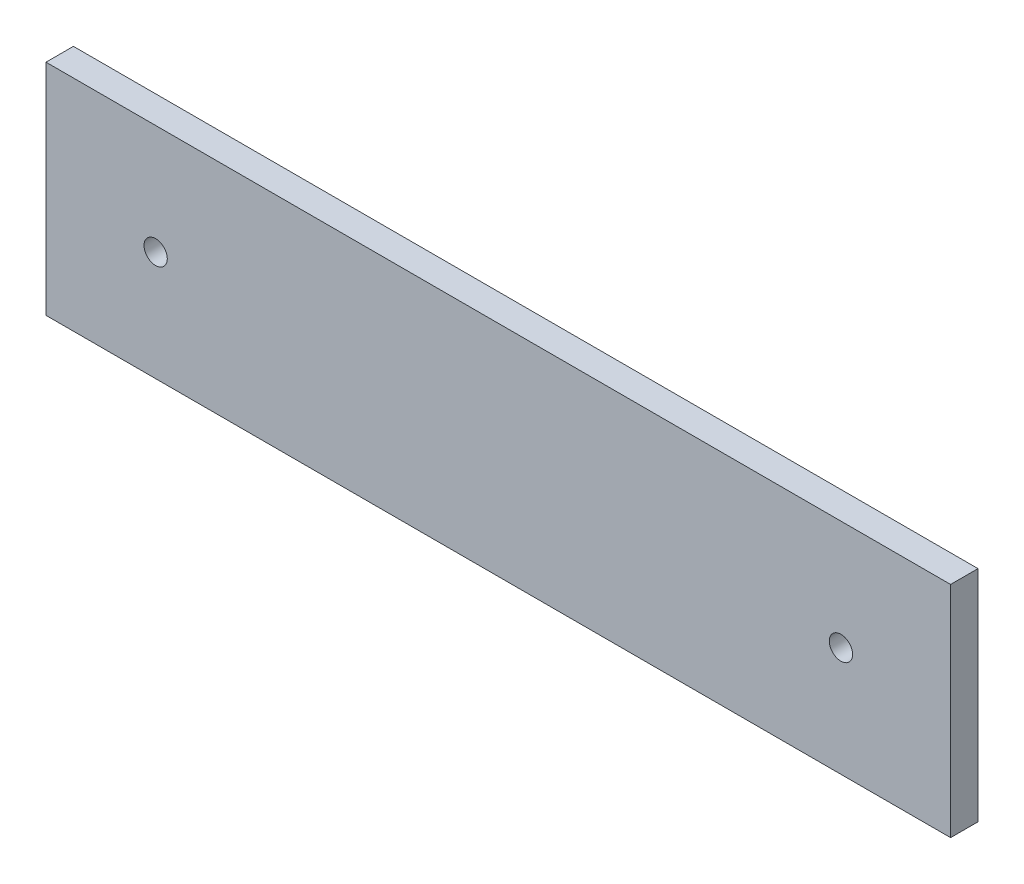
ISO-10303-21;
HEADER;
FILE_DESCRIPTION(('STEP AP214'),'2;1');
FILE_NAME('part.step','',(''),(''),'','','');
FILE_SCHEMA(('AUTOMOTIVE_DESIGN { 1 0 10303 214 1 1 1 1 }'));
ENDSEC;
DATA;
#1=APPLICATION_CONTEXT('core data for automotive mechanical design processes');
#2=APPLICATION_PROTOCOL_DEFINITION('international standard','automotive_design',2000,#1);
#3=PRODUCT_CONTEXT('',#1,'mechanical');
#4=PRODUCT('Part','Part','',(#3));
#5=PRODUCT_RELATED_PRODUCT_CATEGORY('part','',(#4));
#6=PRODUCT_DEFINITION_FORMATION('','',#4);
#7=PRODUCT_DEFINITION_CONTEXT('part definition',#1,'design');
#8=PRODUCT_DEFINITION('design','',#6,#7);
#9=PRODUCT_DEFINITION_SHAPE('','',#8);
#10=(LENGTH_UNIT() NAMED_UNIT(*) SI_UNIT(.MILLI.,.METRE.));
#11=(NAMED_UNIT(*) PLANE_ANGLE_UNIT() SI_UNIT($,.RADIAN.));
#12=(NAMED_UNIT(*) SI_UNIT($,.STERADIAN.) SOLID_ANGLE_UNIT());
#13=UNCERTAINTY_MEASURE_WITH_UNIT(LENGTH_MEASURE(1.E-05),#10,'distance_accuracy_value','');
#14=(GEOMETRIC_REPRESENTATION_CONTEXT(3) GLOBAL_UNCERTAINTY_ASSIGNED_CONTEXT((#13)) GLOBAL_UNIT_ASSIGNED_CONTEXT((#10,
#11,#12)) REPRESENTATION_CONTEXT('',''));
#15=CARTESIAN_POINT('',(0.,0.,0.));
#16=DIRECTION('',(0.,0.,1.));
#17=DIRECTION('',(1.,0.,0.));
#18=AXIS2_PLACEMENT_3D('',#15,#16,#17);
#19=CARTESIAN_POINT('',(0.,0.,2.));
#20=DIRECTION('',(0.,0.,-1.));
#21=DIRECTION('',(-1.,0.,0.));
#22=AXIS2_PLACEMENT_3D('',#19,#20,#21);
#23=PLANE('',#22);
#24=DIRECTION('',(0.,1.,0.));
#25=VECTOR('',#24,1.);
#26=CARTESIAN_POINT('',(116.,-16.,2.));
#27=LINE('',#26,#25);
#28=CARTESIAN_POINT('',(116.,-16.,2.));
#29=VERTEX_POINT('',#28);
#30=CARTESIAN_POINT('',(116.,16.,2.));
#31=VERTEX_POINT('',#30);
#32=EDGE_CURVE('E91',#29,#31,#27,.T.);
#33=ORIENTED_EDGE('',*,*,#32,.T.);
#34=DIRECTION('',(-1.,0.,0.));
#35=VECTOR('',#34,1.);
#36=CARTESIAN_POINT('',(-16.,16.,2.));
#37=LINE('',#36,#35);
#38=CARTESIAN_POINT('',(-16.,16.,2.));
#39=VERTEX_POINT('',#38);
#40=EDGE_CURVE('E86',#31,#39,#37,.T.);
#41=ORIENTED_EDGE('',*,*,#40,.T.);
#42=DIRECTION('',(0.,-1.,0.));
#43=VECTOR('',#42,1.);
#44=CARTESIAN_POINT('',(-16.,-16.,2.));
#45=LINE('',#44,#43);
#46=CARTESIAN_POINT('',(-16.,-16.,2.));
#47=VERTEX_POINT('',#46);
#48=EDGE_CURVE('E93',#39,#47,#45,.T.);
#49=ORIENTED_EDGE('',*,*,#48,.T.);
#50=DIRECTION('',(1.,0.,0.));
#51=VECTOR('',#50,1.);
#52=CARTESIAN_POINT('',(-16.,-16.,2.));
#53=LINE('',#52,#51);
#54=EDGE_CURVE('E59',#47,#29,#53,.T.);
#55=ORIENTED_EDGE('',*,*,#54,.T.);
#56=EDGE_LOOP('',(#33,#41,#49,#55));
#57=FACE_BOUND('',#56,.T.);
#58=CARTESIAN_POINT('',(0.,0.,2.));
#59=DIRECTION('',(0.,0.,1.));
#60=DIRECTION('',(1.,0.,0.));
#61=AXIS2_PLACEMENT_3D('',#58,#59,#60);
#62=CIRCLE('',#61,1.7);
#63=CARTESIAN_POINT('',(1.7,0.,2.));
#64=VERTEX_POINT('',#63);
#65=EDGE_CURVE('E107',#64,#64,#62,.T.);
#66=ORIENTED_EDGE('',*,*,#65,.F.);
#67=EDGE_LOOP('',(#66));
#68=FACE_BOUND('',#67,.T.);
#69=CARTESIAN_POINT('',(100.,0.,2.));
#70=DIRECTION('',(0.,0.,1.));
#71=DIRECTION('',(1.,0.,0.));
#72=AXIS2_PLACEMENT_3D('',#69,#70,#71);
#73=CIRCLE('',#72,1.69999999999999);
#74=CARTESIAN_POINT('',(101.7,0.,2.));
#75=VERTEX_POINT('',#74);
#76=EDGE_CURVE('E124',#75,#75,#73,.T.);
#77=ORIENTED_EDGE('',*,*,#76,.F.);
#78=EDGE_LOOP('',(#77));
#79=FACE_BOUND('',#78,.T.);
#80=ADVANCED_FACE('F41',(#57,#68,#79),#23,.F.);
#81=CARTESIAN_POINT('',(0.,0.,-2.));
#82=DIRECTION('',(0.,0.,-1.));
#83=DIRECTION('',(-1.,0.,0.));
#84=AXIS2_PLACEMENT_3D('',#81,#82,#83);
#85=PLANE('',#84);
#86=CARTESIAN_POINT('',(0.,0.,-2.));
#87=DIRECTION('',(0.,0.,1.));
#88=DIRECTION('',(1.,0.,0.));
#89=AXIS2_PLACEMENT_3D('',#86,#87,#88);
#90=CIRCLE('',#89,1.7);
#91=CARTESIAN_POINT('',(1.7,0.,-2.));
#92=VERTEX_POINT('',#91);
#93=EDGE_CURVE('E120',#92,#92,#90,.T.);
#94=ORIENTED_EDGE('',*,*,#93,.T.);
#95=EDGE_LOOP('',(#94));
#96=FACE_BOUND('',#95,.T.);
#97=DIRECTION('',(0.,1.,0.));
#98=VECTOR('',#97,1.);
#99=CARTESIAN_POINT('',(116.,-16.,-2.));
#100=LINE('',#99,#98);
#101=CARTESIAN_POINT('',(116.,-16.,-2.));
#102=VERTEX_POINT('',#101);
#103=CARTESIAN_POINT('',(116.,16.,-2.));
#104=VERTEX_POINT('',#103);
#105=EDGE_CURVE('E104',#102,#104,#100,.T.);
#106=ORIENTED_EDGE('',*,*,#105,.F.);
#107=DIRECTION('',(1.,0.,0.));
#108=VECTOR('',#107,1.);
#109=CARTESIAN_POINT('',(-16.,-16.,-2.));
#110=LINE('',#109,#108);
#111=CARTESIAN_POINT('',(-16.,-16.,-2.));
#112=VERTEX_POINT('',#111);
#113=EDGE_CURVE('E82',#112,#102,#110,.T.);
#114=ORIENTED_EDGE('',*,*,#113,.F.);
#115=DIRECTION('',(0.,-1.,0.));
#116=VECTOR('',#115,1.);
#117=CARTESIAN_POINT('',(-16.,-16.,-2.));
#118=LINE('',#117,#116);
#119=CARTESIAN_POINT('',(-16.,16.,-2.));
#120=VERTEX_POINT('',#119);
#121=EDGE_CURVE('E73',#120,#112,#118,.T.);
#122=ORIENTED_EDGE('',*,*,#121,.F.);
#123=DIRECTION('',(-1.,0.,0.));
#124=VECTOR('',#123,1.);
#125=CARTESIAN_POINT('',(-16.,16.,-2.));
#126=LINE('',#125,#124);
#127=EDGE_CURVE('E100',#104,#120,#126,.T.);
#128=ORIENTED_EDGE('',*,*,#127,.F.);
#129=EDGE_LOOP('',(#106,#114,#122,#128));
#130=FACE_BOUND('',#129,.T.);
#131=CARTESIAN_POINT('',(100.,0.,-2.));
#132=DIRECTION('',(0.,0.,1.));
#133=DIRECTION('',(1.,0.,0.));
#134=AXIS2_PLACEMENT_3D('',#131,#132,#133);
#135=CIRCLE('',#134,1.69999999999999);
#136=CARTESIAN_POINT('',(101.7,0.,-2.));
#137=VERTEX_POINT('',#136);
#138=EDGE_CURVE('E127',#137,#137,#135,.T.);
#139=ORIENTED_EDGE('',*,*,#138,.T.);
#140=EDGE_LOOP('',(#139));
#141=FACE_BOUND('',#140,.T.);
#142=ADVANCED_FACE('F116',(#96,#130,#141),#85,.T.);
#143=CARTESIAN_POINT('',(116.,-16.,2.));
#144=DIRECTION('',(-1.,0.,0.));
#145=DIRECTION('',(0.,0.,1.));
#146=AXIS2_PLACEMENT_3D('',#143,#144,#145);
#147=PLANE('',#146);
#148=ORIENTED_EDGE('',*,*,#105,.T.);
#149=DIRECTION('',(0.,0.,-1.));
#150=VECTOR('',#149,1.);
#151=CARTESIAN_POINT('',(116.,16.,2.));
#152=LINE('',#151,#150);
#153=EDGE_CURVE('E11',#31,#104,#152,.T.);
#154=ORIENTED_EDGE('',*,*,#153,.F.);
#155=ORIENTED_EDGE('',*,*,#32,.F.);
#156=DIRECTION('',(0.,0.,-1.));
#157=VECTOR('',#156,1.);
#158=CARTESIAN_POINT('',(116.,-16.,2.));
#159=LINE('',#158,#157);
#160=EDGE_CURVE('E101',#29,#102,#159,.T.);
#161=ORIENTED_EDGE('',*,*,#160,.T.);
#162=EDGE_LOOP('',(#148,#154,#155,#161));
#163=FACE_BOUND('',#162,.T.);
#164=ADVANCED_FACE('F43',(#163),#147,.F.);
#165=CARTESIAN_POINT('',(-16.,16.,2.));
#166=DIRECTION('',(0.,-1.,0.));
#167=DIRECTION('',(0.,0.,-1.));
#168=AXIS2_PLACEMENT_3D('',#165,#166,#167);
#169=PLANE('',#168);
#170=ORIENTED_EDGE('',*,*,#127,.T.);
#171=DIRECTION('',(0.,0.,-1.));
#172=VECTOR('',#171,1.);
#173=CARTESIAN_POINT('',(-16.,16.,2.));
#174=LINE('',#173,#172);
#175=EDGE_CURVE('E49',#39,#120,#174,.T.);
#176=ORIENTED_EDGE('',*,*,#175,.F.);
#177=ORIENTED_EDGE('',*,*,#40,.F.);
#178=ORIENTED_EDGE('',*,*,#153,.T.);
#179=EDGE_LOOP('',(#170,#176,#177,#178));
#180=FACE_BOUND('',#179,.T.);
#181=ADVANCED_FACE('F96',(#180),#169,.F.);
#182=CARTESIAN_POINT('',(-16.,-16.,2.));
#183=DIRECTION('',(1.,0.,0.));
#184=DIRECTION('',(0.,0.,-1.));
#185=AXIS2_PLACEMENT_3D('',#182,#183,#184);
#186=PLANE('',#185);
#187=ORIENTED_EDGE('',*,*,#121,.T.);
#188=DIRECTION('',(0.,0.,-1.));
#189=VECTOR('',#188,1.);
#190=CARTESIAN_POINT('',(-16.,-16.,2.));
#191=LINE('',#190,#189);
#192=EDGE_CURVE('E98',#47,#112,#191,.T.);
#193=ORIENTED_EDGE('',*,*,#192,.F.);
#194=ORIENTED_EDGE('',*,*,#48,.F.);
#195=ORIENTED_EDGE('',*,*,#175,.T.);
#196=EDGE_LOOP('',(#187,#193,#194,#195));
#197=FACE_BOUND('',#196,.T.);
#198=ADVANCED_FACE('F97',(#197),#186,.F.);
#199=CARTESIAN_POINT('',(-16.,-16.,2.));
#200=DIRECTION('',(0.,1.,0.));
#201=DIRECTION('',(0.,0.,1.));
#202=AXIS2_PLACEMENT_3D('',#199,#200,#201);
#203=PLANE('',#202);
#204=ORIENTED_EDGE('',*,*,#113,.T.);
#205=ORIENTED_EDGE('',*,*,#160,.F.);
#206=ORIENTED_EDGE('',*,*,#54,.F.);
#207=ORIENTED_EDGE('',*,*,#192,.T.);
#208=EDGE_LOOP('',(#204,#205,#206,#207));
#209=FACE_BOUND('',#208,.T.);
#210=ADVANCED_FACE('F114',(#209),#203,.F.);
#211=CARTESIAN_POINT('',(0.,0.,2.));
#212=DIRECTION('',(0.,0.,-1.));
#213=DIRECTION('',(-1.,0.,0.));
#214=AXIS2_PLACEMENT_3D('',#211,#212,#213);
#215=CYLINDRICAL_SURFACE('',#214,1.7);
#216=ORIENTED_EDGE('',*,*,#65,.T.);
#217=EDGE_LOOP('',(#216));
#218=FACE_BOUND('',#217,.T.);
#219=ORIENTED_EDGE('',*,*,#93,.F.);
#220=EDGE_LOOP('',(#219));
#221=FACE_BOUND('',#220,.T.);
#222=ADVANCED_FACE('F141',(#218,#221),#215,.F.);
#223=CARTESIAN_POINT('',(100.,0.,2.));
#224=DIRECTION('',(0.,0.,-1.));
#225=DIRECTION('',(-1.,0.,0.));
#226=AXIS2_PLACEMENT_3D('',#223,#224,#225);
#227=CYLINDRICAL_SURFACE('',#226,1.69999999999999);
#228=ORIENTED_EDGE('',*,*,#76,.T.);
#229=EDGE_LOOP('',(#228));
#230=FACE_BOUND('',#229,.T.);
#231=ORIENTED_EDGE('',*,*,#138,.F.);
#232=EDGE_LOOP('',(#231));
#233=FACE_BOUND('',#232,.T.);
#234=ADVANCED_FACE('F132',(#230,#233),#227,.F.);
#235=CLOSED_SHELL('',(#80,#142,#164,#181,#198,#210,#222,#234));
#236=MANIFOLD_SOLID_BREP('B2',#235);
#237=ADVANCED_BREP_SHAPE_REPRESENTATION('',(#18,#236),#14);
#238=SHAPE_DEFINITION_REPRESENTATION(#9,#237);
ENDSEC;
END-ISO-10303-21;
